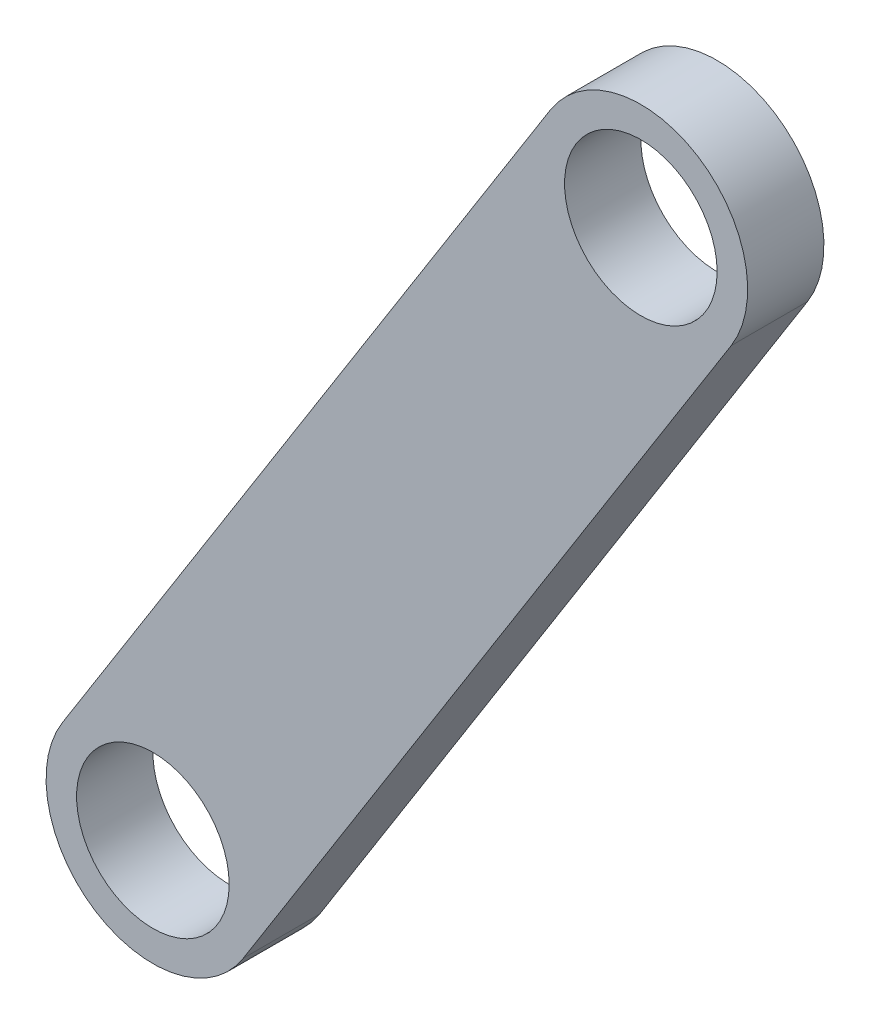
ISO-10303-21;
HEADER;
FILE_DESCRIPTION(('STEP AP214'),'2;1');
FILE_NAME('part.step','',(''),(''),'','','');
FILE_SCHEMA(('AUTOMOTIVE_DESIGN { 1 0 10303 214 1 1 1 1 }'));
ENDSEC;
DATA;
#1=APPLICATION_CONTEXT('core data for automotive mechanical design processes');
#2=APPLICATION_PROTOCOL_DEFINITION('international standard','automotive_design',2000,#1);
#3=PRODUCT_CONTEXT('',#1,'mechanical');
#4=PRODUCT('Part','Part','',(#3));
#5=PRODUCT_RELATED_PRODUCT_CATEGORY('part','',(#4));
#6=PRODUCT_DEFINITION_FORMATION('','',#4);
#7=PRODUCT_DEFINITION_CONTEXT('part definition',#1,'design');
#8=PRODUCT_DEFINITION('design','',#6,#7);
#9=PRODUCT_DEFINITION_SHAPE('','',#8);
#10=(LENGTH_UNIT() NAMED_UNIT(*) SI_UNIT(.MILLI.,.METRE.));
#11=(NAMED_UNIT(*) PLANE_ANGLE_UNIT() SI_UNIT($,.RADIAN.));
#12=(NAMED_UNIT(*) SI_UNIT($,.STERADIAN.) SOLID_ANGLE_UNIT());
#13=UNCERTAINTY_MEASURE_WITH_UNIT(LENGTH_MEASURE(1.E-05),#10,'distance_accuracy_value','');
#14=(GEOMETRIC_REPRESENTATION_CONTEXT(3) GLOBAL_UNCERTAINTY_ASSIGNED_CONTEXT((#13)) GLOBAL_UNIT_ASSIGNED_CONTEXT((#10,
#11,#12)) REPRESENTATION_CONTEXT('',''));
#15=CARTESIAN_POINT('',(0.,0.,0.));
#16=DIRECTION('',(0.,0.,1.));
#17=DIRECTION('',(1.,0.,0.));
#18=AXIS2_PLACEMENT_3D('',#15,#16,#17);
#19=CARTESIAN_POINT('',(1.38777878078145E-13,11.9999999999998,5.));
#20=DIRECTION('',(0.,0.,1.));
#21=DIRECTION('',(1.,0.,0.));
#22=AXIS2_PLACEMENT_3D('',#19,#20,#21);
#23=PLANE('',#22);
#24=CARTESIAN_POINT('',(1.38777878078145E-13,11.9999999999998,5.));
#25=DIRECTION('',(0.,0.,1.));
#26=DIRECTION('',(1.,0.,0.));
#27=AXIS2_PLACEMENT_3D('',#24,#25,#26);
#28=CIRCLE('',#27,5.);
#29=CARTESIAN_POINT('',(5.00000000000014,11.9999999999998,5.));
#30=VERTEX_POINT('',#29);
#31=EDGE_CURVE('E98',#30,#30,#28,.T.);
#32=ORIENTED_EDGE('',*,*,#31,.F.);
#33=EDGE_LOOP('',(#32));
#34=FACE_BOUND('',#33,.T.);
#35=CARTESIAN_POINT('',(1.38777878078145E-13,11.9999999999998,5.));
#36=DIRECTION('',(0.,0.,1.));
#37=DIRECTION('',(1.,0.,0.));
#38=AXIS2_PLACEMENT_3D('',#35,#36,#37);
#39=CIRCLE('',#38,7.);
#40=CARTESIAN_POINT('',(-5.92269133957136,15.7311830960385,5.));
#41=VERTEX_POINT('',#40);
#42=CARTESIAN_POINT('',(5.92269133957164,8.26881690396115,5.));
#43=VERTEX_POINT('',#42);
#44=EDGE_CURVE('E83',#41,#43,#39,.T.);
#45=ORIENTED_EDGE('',*,*,#44,.T.);
#46=DIRECTION('',(0.533026156576954,0.846098762795928,0.));
#47=VECTOR('',#46,1.);
#48=CARTESIAN_POINT('',(5.92269133957164,8.26881690396115,5.));
#49=LINE('',#48,#47);
#50=CARTESIAN_POINT('',(37.9042607341889,59.0347426717168,5.));
#51=VERTEX_POINT('',#50);
#52=EDGE_CURVE('E78',#43,#51,#49,.T.);
#53=ORIENTED_EDGE('',*,*,#52,.T.);
#54=CARTESIAN_POINT('',(31.9815693946174,62.7659257677555,5.));
#55=DIRECTION('',(0.,0.,1.));
#56=DIRECTION('',(1.,0.,0.));
#57=AXIS2_PLACEMENT_3D('',#54,#55,#56);
#58=CIRCLE('',#57,7.);
#59=CARTESIAN_POINT('',(26.0588780550459,66.4971088637942,5.));
#60=VERTEX_POINT('',#59);
#61=EDGE_CURVE('E81',#51,#60,#58,.T.);
#62=ORIENTED_EDGE('',*,*,#61,.T.);
#63=DIRECTION('',(-0.533026156576955,-0.846098762795928,0.));
#64=VECTOR('',#63,1.);
#65=CARTESIAN_POINT('',(-5.92269133957136,15.7311830960385,5.));
#66=LINE('',#65,#64);
#67=EDGE_CURVE('E48',#60,#41,#66,.T.);
#68=ORIENTED_EDGE('',*,*,#67,.T.);
#69=EDGE_LOOP('',(#45,#53,#62,#68));
#70=FACE_BOUND('',#69,.T.);
#71=CARTESIAN_POINT('',(31.9815693946174,62.7659257677555,5.));
#72=DIRECTION('',(0.,0.,1.));
#73=DIRECTION('',(1.,0.,0.));
#74=AXIS2_PLACEMENT_3D('',#71,#72,#73);
#75=CIRCLE('',#74,5.);
#76=CARTESIAN_POINT('',(36.9815693946174,62.7659257677555,5.));
#77=VERTEX_POINT('',#76);
#78=EDGE_CURVE('E113',#77,#77,#75,.T.);
#79=ORIENTED_EDGE('',*,*,#78,.F.);
#80=EDGE_LOOP('',(#79));
#81=FACE_BOUND('',#80,.T.);
#82=ADVANCED_FACE('F31',(#34,#70,#81),#23,.T.);
#83=CARTESIAN_POINT('',(1.38777878078145E-13,11.9999999999998,0.));
#84=DIRECTION('',(0.,0.,1.));
#85=DIRECTION('',(1.,0.,0.));
#86=AXIS2_PLACEMENT_3D('',#83,#84,#85);
#87=PLANE('',#86);
#88=CARTESIAN_POINT('',(1.38777878078145E-13,11.9999999999998,0.));
#89=DIRECTION('',(0.,0.,1.));
#90=DIRECTION('',(1.,0.,0.));
#91=AXIS2_PLACEMENT_3D('',#88,#89,#90);
#92=CIRCLE('',#91,7.);
#93=CARTESIAN_POINT('',(-5.92269133957136,15.7311830960385,0.));
#94=VERTEX_POINT('',#93);
#95=CARTESIAN_POINT('',(5.92269133957164,8.26881690396115,0.));
#96=VERTEX_POINT('',#95);
#97=EDGE_CURVE('E95',#94,#96,#92,.T.);
#98=ORIENTED_EDGE('',*,*,#97,.F.);
#99=DIRECTION('',(-0.533026156576955,-0.846098762795928,0.));
#100=VECTOR('',#99,1.);
#101=CARTESIAN_POINT('',(-5.92269133957136,15.7311830960385,0.));
#102=LINE('',#101,#100);
#103=CARTESIAN_POINT('',(26.0588780550459,66.4971088637942,0.));
#104=VERTEX_POINT('',#103);
#105=EDGE_CURVE('E71',#104,#94,#102,.T.);
#106=ORIENTED_EDGE('',*,*,#105,.F.);
#107=CARTESIAN_POINT('',(31.9815693946174,62.7659257677555,0.));
#108=DIRECTION('',(0.,0.,1.));
#109=DIRECTION('',(1.,0.,0.));
#110=AXIS2_PLACEMENT_3D('',#107,#108,#109);
#111=CIRCLE('',#110,7.);
#112=CARTESIAN_POINT('',(37.9042607341889,59.0347426717168,0.));
#113=VERTEX_POINT('',#112);
#114=EDGE_CURVE('E65',#113,#104,#111,.T.);
#115=ORIENTED_EDGE('',*,*,#114,.F.);
#116=DIRECTION('',(0.533026156576954,0.846098762795928,0.));
#117=VECTOR('',#116,1.);
#118=CARTESIAN_POINT('',(5.92269133957164,8.26881690396115,0.));
#119=LINE('',#118,#117);
#120=EDGE_CURVE('E87',#96,#113,#119,.T.);
#121=ORIENTED_EDGE('',*,*,#120,.F.);
#122=EDGE_LOOP('',(#98,#106,#115,#121));
#123=FACE_BOUND('',#122,.T.);
#124=CARTESIAN_POINT('',(1.38777878078145E-13,11.9999999999998,0.));
#125=DIRECTION('',(0.,0.,1.));
#126=DIRECTION('',(1.,0.,0.));
#127=AXIS2_PLACEMENT_3D('',#124,#125,#126);
#128=CIRCLE('',#127,5.);
#129=CARTESIAN_POINT('',(5.00000000000014,11.9999999999998,0.));
#130=VERTEX_POINT('',#129);
#131=EDGE_CURVE('E110',#130,#130,#128,.T.);
#132=ORIENTED_EDGE('',*,*,#131,.T.);
#133=EDGE_LOOP('',(#132));
#134=FACE_BOUND('',#133,.T.);
#135=CARTESIAN_POINT('',(31.9815693946174,62.7659257677555,0.));
#136=DIRECTION('',(0.,0.,1.));
#137=DIRECTION('',(1.,0.,0.));
#138=AXIS2_PLACEMENT_3D('',#135,#136,#137);
#139=CIRCLE('',#138,5.);
#140=CARTESIAN_POINT('',(36.9815693946174,62.7659257677555,0.));
#141=VERTEX_POINT('',#140);
#142=EDGE_CURVE('E116',#141,#141,#139,.T.);
#143=ORIENTED_EDGE('',*,*,#142,.T.);
#144=EDGE_LOOP('',(#143));
#145=FACE_BOUND('',#144,.T.);
#146=ADVANCED_FACE('F106',(#123,#134,#145),#87,.F.);
#147=CARTESIAN_POINT('',(1.38777878078145E-13,11.9999999999998,5.));
#148=DIRECTION('',(0.,0.,-1.));
#149=DIRECTION('',(-1.,0.,0.));
#150=AXIS2_PLACEMENT_3D('',#147,#148,#149);
#151=CYLINDRICAL_SURFACE('',#150,7.);
#152=ORIENTED_EDGE('',*,*,#97,.T.);
#153=DIRECTION('',(0.,0.,-1.));
#154=VECTOR('',#153,1.);
#155=CARTESIAN_POINT('',(5.92269133957164,8.26881690396115,5.));
#156=LINE('',#155,#154);
#157=EDGE_CURVE('E11',#43,#96,#156,.T.);
#158=ORIENTED_EDGE('',*,*,#157,.F.);
#159=ORIENTED_EDGE('',*,*,#44,.F.);
#160=DIRECTION('',(0.,0.,-1.));
#161=VECTOR('',#160,1.);
#162=CARTESIAN_POINT('',(-5.92269133957136,15.7311830960385,5.));
#163=LINE('',#162,#161);
#164=EDGE_CURVE('E91',#41,#94,#163,.T.);
#165=ORIENTED_EDGE('',*,*,#164,.T.);
#166=EDGE_LOOP('',(#152,#158,#159,#165));
#167=FACE_BOUND('',#166,.T.);
#168=ADVANCED_FACE('F33',(#167),#151,.T.);
#169=CARTESIAN_POINT('',(5.92269133957164,8.26881690396115,5.));
#170=DIRECTION('',(-0.846098762795928,0.533026156576954,0.));
#171=DIRECTION('',(-0.533026156576954,-0.846098762795928,0.));
#172=AXIS2_PLACEMENT_3D('',#169,#170,#171);
#173=PLANE('',#172);
#174=ORIENTED_EDGE('',*,*,#120,.T.);
#175=DIRECTION('',(0.,0.,-1.));
#176=VECTOR('',#175,1.);
#177=CARTESIAN_POINT('',(37.9042607341889,59.0347426717168,5.));
#178=LINE('',#177,#176);
#179=EDGE_CURVE('E40',#51,#113,#178,.T.);
#180=ORIENTED_EDGE('',*,*,#179,.F.);
#181=ORIENTED_EDGE('',*,*,#52,.F.);
#182=ORIENTED_EDGE('',*,*,#157,.T.);
#183=EDGE_LOOP('',(#174,#180,#181,#182));
#184=FACE_BOUND('',#183,.T.);
#185=ADVANCED_FACE('F86',(#184),#173,.F.);
#186=CARTESIAN_POINT('',(31.9815693946174,62.7659257677555,5.));
#187=DIRECTION('',(0.,0.,-1.));
#188=DIRECTION('',(-1.,0.,0.));
#189=AXIS2_PLACEMENT_3D('',#186,#187,#188);
#190=CYLINDRICAL_SURFACE('',#189,7.);
#191=ORIENTED_EDGE('',*,*,#114,.T.);
#192=DIRECTION('',(0.,0.,-1.));
#193=VECTOR('',#192,1.);
#194=CARTESIAN_POINT('',(26.0588780550459,66.4971088637942,5.));
#195=LINE('',#194,#193);
#196=EDGE_CURVE('E88',#60,#104,#195,.T.);
#197=ORIENTED_EDGE('',*,*,#196,.F.);
#198=ORIENTED_EDGE('',*,*,#61,.F.);
#199=ORIENTED_EDGE('',*,*,#179,.T.);
#200=EDGE_LOOP('',(#191,#197,#198,#199));
#201=FACE_BOUND('',#200,.T.);
#202=ADVANCED_FACE('F89',(#201),#190,.T.);
#203=CARTESIAN_POINT('',(-5.92269133957136,15.7311830960385,5.));
#204=DIRECTION('',(0.846098762795928,-0.533026156576955,0.));
#205=DIRECTION('',(0.533026156576955,0.846098762795928,0.));
#206=AXIS2_PLACEMENT_3D('',#203,#204,#205);
#207=PLANE('',#206);
#208=ORIENTED_EDGE('',*,*,#105,.T.);
#209=ORIENTED_EDGE('',*,*,#164,.F.);
#210=ORIENTED_EDGE('',*,*,#67,.F.);
#211=ORIENTED_EDGE('',*,*,#196,.T.);
#212=EDGE_LOOP('',(#208,#209,#210,#211));
#213=FACE_BOUND('',#212,.T.);
#214=ADVANCED_FACE('F103',(#213),#207,.F.);
#215=CARTESIAN_POINT('',(1.38777878078145E-13,11.9999999999998,5.));
#216=DIRECTION('',(0.,0.,-1.));
#217=DIRECTION('',(-1.,0.,0.));
#218=AXIS2_PLACEMENT_3D('',#215,#216,#217);
#219=CYLINDRICAL_SURFACE('',#218,5.);
#220=ORIENTED_EDGE('',*,*,#31,.T.);
#221=EDGE_LOOP('',(#220));
#222=FACE_BOUND('',#221,.T.);
#223=ORIENTED_EDGE('',*,*,#131,.F.);
#224=EDGE_LOOP('',(#223));
#225=FACE_BOUND('',#224,.T.);
#226=ADVANCED_FACE('F133',(#222,#225),#219,.F.);
#227=CARTESIAN_POINT('',(31.9815693946174,62.7659257677555,5.));
#228=DIRECTION('',(0.,0.,-1.));
#229=DIRECTION('',(-1.,0.,0.));
#230=AXIS2_PLACEMENT_3D('',#227,#228,#229);
#231=CYLINDRICAL_SURFACE('',#230,5.);
#232=ORIENTED_EDGE('',*,*,#78,.T.);
#233=EDGE_LOOP('',(#232));
#234=FACE_BOUND('',#233,.T.);
#235=ORIENTED_EDGE('',*,*,#142,.F.);
#236=EDGE_LOOP('',(#235));
#237=FACE_BOUND('',#236,.T.);
#238=ADVANCED_FACE('F122',(#234,#237),#231,.F.);
#239=CLOSED_SHELL('',(#82,#146,#168,#185,#202,#214,#226,#238));
#240=MANIFOLD_SOLID_BREP('B2',#239);
#241=ADVANCED_BREP_SHAPE_REPRESENTATION('',(#18,#240),#14);
#242=SHAPE_DEFINITION_REPRESENTATION(#9,#241);
ENDSEC;
END-ISO-10303-21;
